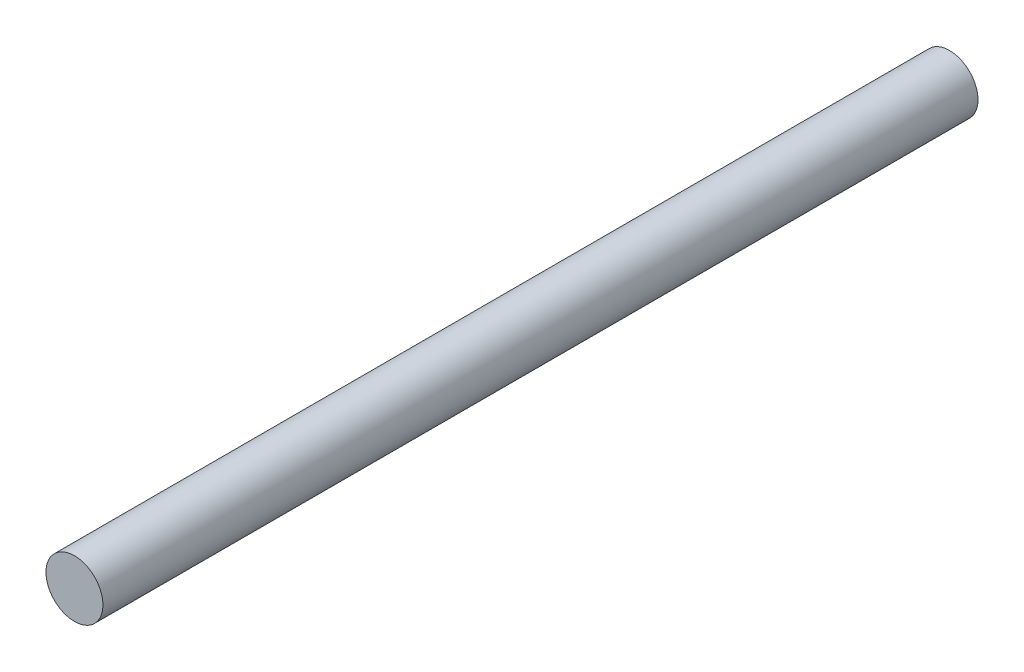
ISO-10303-21;
HEADER;
FILE_DESCRIPTION(('STEP AP214'),'2;1');
FILE_NAME('part.step','',(''),(''),'','','');
FILE_SCHEMA(('AUTOMOTIVE_DESIGN { 1 0 10303 214 1 1 1 1 }'));
ENDSEC;
DATA;
#1=APPLICATION_CONTEXT('core data for automotive mechanical design processes');
#2=APPLICATION_PROTOCOL_DEFINITION('international standard','automotive_design',2000,#1);
#3=PRODUCT_CONTEXT('',#1,'mechanical');
#4=PRODUCT('Part','Part','',(#3));
#5=PRODUCT_RELATED_PRODUCT_CATEGORY('part','',(#4));
#6=PRODUCT_DEFINITION_FORMATION('','',#4);
#7=PRODUCT_DEFINITION_CONTEXT('part definition',#1,'design');
#8=PRODUCT_DEFINITION('design','',#6,#7);
#9=PRODUCT_DEFINITION_SHAPE('','',#8);
#10=(LENGTH_UNIT() NAMED_UNIT(*) SI_UNIT(.MILLI.,.METRE.));
#11=(NAMED_UNIT(*) PLANE_ANGLE_UNIT() SI_UNIT($,.RADIAN.));
#12=(NAMED_UNIT(*) SI_UNIT($,.STERADIAN.) SOLID_ANGLE_UNIT());
#13=UNCERTAINTY_MEASURE_WITH_UNIT(LENGTH_MEASURE(1.E-05),#10,'distance_accuracy_value','');
#14=(GEOMETRIC_REPRESENTATION_CONTEXT(3) GLOBAL_UNCERTAINTY_ASSIGNED_CONTEXT((#13)) GLOBAL_UNIT_ASSIGNED_CONTEXT((#10,
#11,#12)) REPRESENTATION_CONTEXT('',''));
#15=CARTESIAN_POINT('',(0.,0.,0.));
#16=DIRECTION('',(0.,0.,1.));
#17=DIRECTION('',(1.,0.,0.));
#18=AXIS2_PLACEMENT_3D('',#15,#16,#17);
#19=CARTESIAN_POINT('',(0.,0.,215.));
#20=DIRECTION('',(0.,0.,-1.));
#21=DIRECTION('',(-1.,0.,0.));
#22=AXIS2_PLACEMENT_3D('',#19,#20,#21);
#23=CYLINDRICAL_SURFACE('',#22,7.);
#24=CARTESIAN_POINT('',(0.,0.,215.));
#25=DIRECTION('',(0.,0.,1.));
#26=DIRECTION('',(1.,0.,0.));
#27=AXIS2_PLACEMENT_3D('',#24,#25,#26);
#28=CIRCLE('',#27,7.);
#29=CARTESIAN_POINT('',(7.,0.,215.));
#30=VERTEX_POINT('',#29);
#31=EDGE_CURVE('E10',#30,#30,#28,.T.);
#32=ORIENTED_EDGE('',*,*,#31,.F.);
#33=EDGE_LOOP('',(#32));
#34=FACE_BOUND('',#33,.T.);
#35=CARTESIAN_POINT('',(0.,0.,0.));
#36=DIRECTION('',(0.,0.,1.));
#37=DIRECTION('',(1.,0.,0.));
#38=AXIS2_PLACEMENT_3D('',#35,#36,#37);
#39=CIRCLE('',#38,7.);
#40=CARTESIAN_POINT('',(7.,0.,0.));
#41=VERTEX_POINT('',#40);
#42=EDGE_CURVE('E38',#41,#41,#39,.T.);
#43=ORIENTED_EDGE('',*,*,#42,.T.);
#44=EDGE_LOOP('',(#43));
#45=FACE_BOUND('',#44,.T.);
#46=ADVANCED_FACE('F35',(#34,#45),#23,.T.);
#47=CARTESIAN_POINT('',(0.,0.,215.));
#48=DIRECTION('',(0.,0.,1.));
#49=DIRECTION('',(1.,0.,0.));
#50=AXIS2_PLACEMENT_3D('',#47,#48,#49);
#51=PLANE('',#50);
#52=ORIENTED_EDGE('',*,*,#31,.T.);
#53=EDGE_LOOP('',(#52));
#54=FACE_BOUND('',#53,.T.);
#55=ADVANCED_FACE('F50',(#54),#51,.T.);
#56=CARTESIAN_POINT('',(0.,0.,0.));
#57=DIRECTION('',(0.,0.,1.));
#58=DIRECTION('',(1.,0.,0.));
#59=AXIS2_PLACEMENT_3D('',#56,#57,#58);
#60=PLANE('',#59);
#61=ORIENTED_EDGE('',*,*,#42,.F.);
#62=EDGE_LOOP('',(#61));
#63=FACE_BOUND('',#62,.T.);
#64=ADVANCED_FACE('F48',(#63),#60,.F.);
#65=CLOSED_SHELL('',(#46,#55,#64));
#66=MANIFOLD_SOLID_BREP('B2',#65);
#67=ADVANCED_BREP_SHAPE_REPRESENTATION('',(#18,#66),#14);
#68=SHAPE_DEFINITION_REPRESENTATION(#9,#67);
ENDSEC;
END-ISO-10303-21;
